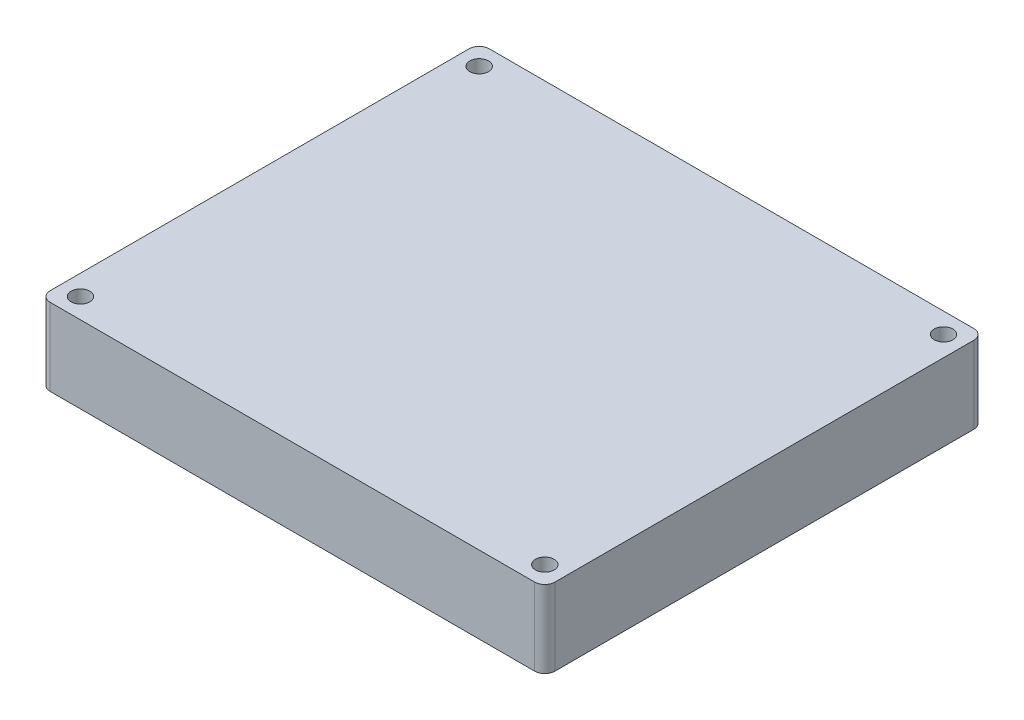
ISO-10303-21;
HEADER;
FILE_DESCRIPTION(('STEP AP214'),'2;1');
FILE_NAME('part.step','',(''),(''),'','','');
FILE_SCHEMA(('AUTOMOTIVE_DESIGN { 1 0 10303 214 1 1 1 1 }'));
ENDSEC;
DATA;
#1=APPLICATION_CONTEXT('core data for automotive mechanical design processes');
#2=APPLICATION_PROTOCOL_DEFINITION('international standard','automotive_design',2000,#1);
#3=PRODUCT_CONTEXT('',#1,'mechanical');
#4=PRODUCT('Part','Part','',(#3));
#5=PRODUCT_RELATED_PRODUCT_CATEGORY('part','',(#4));
#6=PRODUCT_DEFINITION_FORMATION('','',#4);
#7=PRODUCT_DEFINITION_CONTEXT('part definition',#1,'design');
#8=PRODUCT_DEFINITION('design','',#6,#7);
#9=PRODUCT_DEFINITION_SHAPE('','',#8);
#10=(LENGTH_UNIT() NAMED_UNIT(*) SI_UNIT(.MILLI.,.METRE.));
#11=(NAMED_UNIT(*) PLANE_ANGLE_UNIT() SI_UNIT($,.RADIAN.));
#12=(NAMED_UNIT(*) SI_UNIT($,.STERADIAN.) SOLID_ANGLE_UNIT());
#13=UNCERTAINTY_MEASURE_WITH_UNIT(LENGTH_MEASURE(1.E-05),#10,'distance_accuracy_value','');
#14=(GEOMETRIC_REPRESENTATION_CONTEXT(3) GLOBAL_UNCERTAINTY_ASSIGNED_CONTEXT((#13)) GLOBAL_UNIT_ASSIGNED_CONTEXT((#10,
#11,#12)) REPRESENTATION_CONTEXT('',''));
#15=CARTESIAN_POINT('',(0.,0.,0.));
#16=DIRECTION('',(0.,0.,1.));
#17=DIRECTION('',(1.,0.,0.));
#18=AXIS2_PLACEMENT_3D('',#15,#16,#17);
#19=CARTESIAN_POINT('',(-48.,15.29,41.5));
#20=DIRECTION('',(0.,-1.,0.));
#21=DIRECTION('',(0.,0.,-1.));
#22=AXIS2_PLACEMENT_3D('',#19,#20,#21);
#23=PLANE('',#22);
#24=CARTESIAN_POINT('',(-48.,15.29,41.5));
#25=DIRECTION('',(0.,1.,0.));
#26=DIRECTION('',(0.,0.,-1.));
#27=AXIS2_PLACEMENT_3D('',#24,#25,#26);
#28=CIRCLE('',#27,2.);
#29=CARTESIAN_POINT('',(-50.,15.29,41.5));
#30=VERTEX_POINT('',#29);
#31=CARTESIAN_POINT('',(-48.,15.29,43.5));
#32=VERTEX_POINT('',#31);
#33=EDGE_CURVE('E185',#30,#32,#28,.T.);
#34=ORIENTED_EDGE('',*,*,#33,.T.);
#35=DIRECTION('',(1.,0.,0.));
#36=VECTOR('',#35,1.);
#37=CARTESIAN_POINT('',(-48.,15.29,43.5));
#38=LINE('',#37,#36);
#39=CARTESIAN_POINT('',(48.,15.29,43.5));
#40=VERTEX_POINT('',#39);
#41=EDGE_CURVE('E116',#32,#40,#38,.T.);
#42=ORIENTED_EDGE('',*,*,#41,.T.);
#43=CARTESIAN_POINT('',(48.,15.29,41.5));
#44=DIRECTION('',(0.,1.,0.));
#45=DIRECTION('',(0.,0.,1.));
#46=AXIS2_PLACEMENT_3D('',#43,#44,#45);
#47=CIRCLE('',#46,2.);
#48=CARTESIAN_POINT('',(50.,15.29,41.5));
#49=VERTEX_POINT('',#48);
#50=EDGE_CURVE('E207',#40,#49,#47,.T.);
#51=ORIENTED_EDGE('',*,*,#50,.T.);
#52=DIRECTION('',(0.,0.,-1.));
#53=VECTOR('',#52,1.);
#54=CARTESIAN_POINT('',(50.,15.29,41.5));
#55=LINE('',#54,#53);
#56=CARTESIAN_POINT('',(50.,15.29,-41.5));
#57=VERTEX_POINT('',#56);
#58=EDGE_CURVE('E221',#49,#57,#55,.T.);
#59=ORIENTED_EDGE('',*,*,#58,.T.);
#60=CARTESIAN_POINT('',(48.,15.29,-41.5));
#61=DIRECTION('',(0.,1.,0.));
#62=DIRECTION('',(0.,0.,-1.));
#63=AXIS2_PLACEMENT_3D('',#60,#61,#62);
#64=CIRCLE('',#63,2.);
#65=CARTESIAN_POINT('',(48.,15.29,-43.5));
#66=VERTEX_POINT('',#65);
#67=EDGE_CURVE('E140',#57,#66,#64,.T.);
#68=ORIENTED_EDGE('',*,*,#67,.T.);
#69=DIRECTION('',(-1.,0.,0.));
#70=VECTOR('',#69,1.);
#71=CARTESIAN_POINT('',(-48.,15.29,-43.5));
#72=LINE('',#71,#70);
#73=CARTESIAN_POINT('',(-48.,15.29,-43.5));
#74=VERTEX_POINT('',#73);
#75=EDGE_CURVE('E134',#66,#74,#72,.T.);
#76=ORIENTED_EDGE('',*,*,#75,.T.);
#77=CARTESIAN_POINT('',(-48.,15.29,-41.5));
#78=DIRECTION('',(0.,1.,0.));
#79=DIRECTION('',(0.,0.,-1.));
#80=AXIS2_PLACEMENT_3D('',#77,#78,#79);
#81=CIRCLE('',#80,2.);
#82=CARTESIAN_POINT('',(-50.,15.29,-41.5));
#83=VERTEX_POINT('',#82);
#84=EDGE_CURVE('E138',#74,#83,#81,.T.);
#85=ORIENTED_EDGE('',*,*,#84,.T.);
#86=DIRECTION('',(0.,0.,1.));
#87=VECTOR('',#86,1.);
#88=CARTESIAN_POINT('',(-50.,15.29,41.5));
#89=LINE('',#88,#87);
#90=EDGE_CURVE('E67',#83,#30,#89,.T.);
#91=ORIENTED_EDGE('',*,*,#90,.T.);
#92=EDGE_LOOP('',(#34,#42,#51,#59,#68,#76,#85,#91));
#93=FACE_BOUND('',#92,.T.);
#94=CARTESIAN_POINT('',(46.,15.29,-39.5));
#95=DIRECTION('',(0.,1.,0.));
#96=DIRECTION('',(0.,0.,1.));
#97=AXIS2_PLACEMENT_3D('',#94,#95,#96);
#98=CIRCLE('',#97,1.85);
#99=CARTESIAN_POINT('',(46.,15.29,-37.65));
#100=VERTEX_POINT('',#99);
#101=EDGE_CURVE('E168',#100,#100,#98,.T.);
#102=ORIENTED_EDGE('',*,*,#101,.F.);
#103=EDGE_LOOP('',(#102));
#104=FACE_BOUND('',#103,.T.);
#105=CARTESIAN_POINT('',(46.,15.29,39.5));
#106=DIRECTION('',(0.,1.,0.));
#107=DIRECTION('',(0.,0.,1.));
#108=AXIS2_PLACEMENT_3D('',#105,#106,#107);
#109=CIRCLE('',#108,1.85);
#110=CARTESIAN_POINT('',(46.,15.29,41.35));
#111=VERTEX_POINT('',#110);
#112=EDGE_CURVE('E235',#111,#111,#109,.T.);
#113=ORIENTED_EDGE('',*,*,#112,.F.);
#114=EDGE_LOOP('',(#113));
#115=FACE_BOUND('',#114,.T.);
#116=CARTESIAN_POINT('',(-46.,15.29,39.5));
#117=DIRECTION('',(0.,1.,0.));
#118=DIRECTION('',(0.,0.,1.));
#119=AXIS2_PLACEMENT_3D('',#116,#117,#118);
#120=CIRCLE('',#119,1.85);
#121=CARTESIAN_POINT('',(-46.,15.29,41.35));
#122=VERTEX_POINT('',#121);
#123=EDGE_CURVE('E243',#122,#122,#120,.T.);
#124=ORIENTED_EDGE('',*,*,#123,.F.);
#125=EDGE_LOOP('',(#124));
#126=FACE_BOUND('',#125,.T.);
#127=CARTESIAN_POINT('',(-46.,15.29,-39.5));
#128=DIRECTION('',(0.,1.,0.));
#129=DIRECTION('',(0.,0.,1.));
#130=AXIS2_PLACEMENT_3D('',#127,#128,#129);
#131=CIRCLE('',#130,1.85);
#132=CARTESIAN_POINT('',(-46.,15.29,-37.65));
#133=VERTEX_POINT('',#132);
#134=EDGE_CURVE('E250',#133,#133,#131,.T.);
#135=ORIENTED_EDGE('',*,*,#134,.F.);
#136=EDGE_LOOP('',(#135));
#137=FACE_BOUND('',#136,.T.);
#138=ADVANCED_FACE('F46',(#93,#104,#115,#126,#137),#23,.F.);
#139=CARTESIAN_POINT('',(-48.,0.,41.5));
#140=DIRECTION('',(0.,-1.,0.));
#141=DIRECTION('',(0.,0.,-1.));
#142=AXIS2_PLACEMENT_3D('',#139,#140,#141);
#143=PLANE('',#142);
#144=CARTESIAN_POINT('',(-46.,0.,39.5));
#145=DIRECTION('',(0.,1.,0.));
#146=DIRECTION('',(0.,0.,1.));
#147=AXIS2_PLACEMENT_3D('',#144,#145,#146);
#148=CIRCLE('',#147,1.85);
#149=CARTESIAN_POINT('',(-46.,0.,41.35));
#150=VERTEX_POINT('',#149);
#151=EDGE_CURVE('E246',#150,#150,#148,.T.);
#152=ORIENTED_EDGE('',*,*,#151,.T.);
#153=EDGE_LOOP('',(#152));
#154=FACE_BOUND('',#153,.T.);
#155=CARTESIAN_POINT('',(46.,0.,-39.5));
#156=DIRECTION('',(0.,1.,0.));
#157=DIRECTION('',(0.,0.,1.));
#158=AXIS2_PLACEMENT_3D('',#155,#156,#157);
#159=CIRCLE('',#158,1.85);
#160=CARTESIAN_POINT('',(46.,0.,-37.65));
#161=VERTEX_POINT('',#160);
#162=EDGE_CURVE('E231',#161,#161,#159,.T.);
#163=ORIENTED_EDGE('',*,*,#162,.T.);
#164=EDGE_LOOP('',(#163));
#165=FACE_BOUND('',#164,.T.);
#166=CARTESIAN_POINT('',(-48.,0.,41.5));
#167=DIRECTION('',(0.,1.,0.));
#168=DIRECTION('',(0.,0.,-1.));
#169=AXIS2_PLACEMENT_3D('',#166,#167,#168);
#170=CIRCLE('',#169,2.);
#171=CARTESIAN_POINT('',(-50.,0.,41.5));
#172=VERTEX_POINT('',#171);
#173=CARTESIAN_POINT('',(-48.,0.,43.5));
#174=VERTEX_POINT('',#173);
#175=EDGE_CURVE('E163',#172,#174,#170,.T.);
#176=ORIENTED_EDGE('',*,*,#175,.F.);
#177=DIRECTION('',(0.,0.,1.));
#178=VECTOR('',#177,1.);
#179=CARTESIAN_POINT('',(-50.,0.,41.5));
#180=LINE('',#179,#178);
#181=CARTESIAN_POINT('',(-50.,0.,-41.5));
#182=VERTEX_POINT('',#181);
#183=EDGE_CURVE('E108',#182,#172,#180,.T.);
#184=ORIENTED_EDGE('',*,*,#183,.F.);
#185=CARTESIAN_POINT('',(-48.,0.,-41.5));
#186=DIRECTION('',(0.,1.,0.));
#187=DIRECTION('',(0.,0.,-1.));
#188=AXIS2_PLACEMENT_3D('',#185,#186,#187);
#189=CIRCLE('',#188,2.);
#190=CARTESIAN_POINT('',(-48.,0.,-43.5));
#191=VERTEX_POINT('',#190);
#192=EDGE_CURVE('E101',#191,#182,#189,.T.);
#193=ORIENTED_EDGE('',*,*,#192,.F.);
#194=DIRECTION('',(-1.,0.,0.));
#195=VECTOR('',#194,1.);
#196=CARTESIAN_POINT('',(-48.,0.,-43.5));
#197=LINE('',#196,#195);
#198=CARTESIAN_POINT('',(48.,0.,-43.5));
#199=VERTEX_POINT('',#198);
#200=EDGE_CURVE('E149',#199,#191,#197,.T.);
#201=ORIENTED_EDGE('',*,*,#200,.F.);
#202=CARTESIAN_POINT('',(48.,0.,-41.5));
#203=DIRECTION('',(0.,1.,0.));
#204=DIRECTION('',(0.,0.,-1.));
#205=AXIS2_PLACEMENT_3D('',#202,#203,#204);
#206=CIRCLE('',#205,2.);
#207=CARTESIAN_POINT('',(50.,0.,-41.5));
#208=VERTEX_POINT('',#207);
#209=EDGE_CURVE('E177',#208,#199,#206,.T.);
#210=ORIENTED_EDGE('',*,*,#209,.F.);
#211=DIRECTION('',(0.,0.,-1.));
#212=VECTOR('',#211,1.);
#213=CARTESIAN_POINT('',(50.,0.,41.5));
#214=LINE('',#213,#212);
#215=CARTESIAN_POINT('',(50.,0.,41.5));
#216=VERTEX_POINT('',#215);
#217=EDGE_CURVE('E174',#216,#208,#214,.T.);
#218=ORIENTED_EDGE('',*,*,#217,.F.);
#219=CARTESIAN_POINT('',(48.,0.,41.5));
#220=DIRECTION('',(0.,1.,0.));
#221=DIRECTION('',(0.,0.,1.));
#222=AXIS2_PLACEMENT_3D('',#219,#220,#221);
#223=CIRCLE('',#222,2.);
#224=CARTESIAN_POINT('',(48.,0.,43.5));
#225=VERTEX_POINT('',#224);
#226=EDGE_CURVE('E171',#225,#216,#223,.T.);
#227=ORIENTED_EDGE('',*,*,#226,.F.);
#228=DIRECTION('',(1.,0.,0.));
#229=VECTOR('',#228,1.);
#230=CARTESIAN_POINT('',(-48.,0.,43.5));
#231=LINE('',#230,#229);
#232=EDGE_CURVE('E167',#174,#225,#231,.T.);
#233=ORIENTED_EDGE('',*,*,#232,.F.);
#234=EDGE_LOOP('',(#176,#184,#193,#201,#210,#218,#227,#233));
#235=FACE_BOUND('',#234,.T.);
#236=CARTESIAN_POINT('',(46.,0.,39.5));
#237=DIRECTION('',(0.,1.,0.));
#238=DIRECTION('',(0.,0.,1.));
#239=AXIS2_PLACEMENT_3D('',#236,#237,#238);
#240=CIRCLE('',#239,1.85);
#241=CARTESIAN_POINT('',(46.,0.,41.35));
#242=VERTEX_POINT('',#241);
#243=EDGE_CURVE('E239',#242,#242,#240,.T.);
#244=ORIENTED_EDGE('',*,*,#243,.T.);
#245=EDGE_LOOP('',(#244));
#246=FACE_BOUND('',#245,.T.);
#247=CARTESIAN_POINT('',(-46.,0.,-39.5));
#248=DIRECTION('',(0.,1.,0.));
#249=DIRECTION('',(0.,0.,1.));
#250=AXIS2_PLACEMENT_3D('',#247,#248,#249);
#251=CIRCLE('',#250,1.85);
#252=CARTESIAN_POINT('',(-46.,0.,-37.65));
#253=VERTEX_POINT('',#252);
#254=EDGE_CURVE('E254',#253,#253,#251,.T.);
#255=ORIENTED_EDGE('',*,*,#254,.T.);
#256=EDGE_LOOP('',(#255));
#257=FACE_BOUND('',#256,.T.);
#258=ADVANCED_FACE('F211',(#154,#165,#235,#246,#257),#143,.T.);
#259=CARTESIAN_POINT('',(-48.,15.29,41.5));
#260=DIRECTION('',(0.,-1.,0.));
#261=DIRECTION('',(0.,0.,-1.));
#262=AXIS2_PLACEMENT_3D('',#259,#260,#261);
#263=CYLINDRICAL_SURFACE('',#262,2.);
#264=ORIENTED_EDGE('',*,*,#175,.T.);
#265=DIRECTION('',(0.,-1.,0.));
#266=VECTOR('',#265,1.);
#267=CARTESIAN_POINT('',(-48.,15.29,43.5));
#268=LINE('',#267,#266);
#269=EDGE_CURVE('E11',#32,#174,#268,.T.);
#270=ORIENTED_EDGE('',*,*,#269,.F.);
#271=ORIENTED_EDGE('',*,*,#33,.F.);
#272=DIRECTION('',(0.,-1.,0.));
#273=VECTOR('',#272,1.);
#274=CARTESIAN_POINT('',(-50.,15.29,41.5));
#275=LINE('',#274,#273);
#276=EDGE_CURVE('E159',#30,#172,#275,.T.);
#277=ORIENTED_EDGE('',*,*,#276,.T.);
#278=EDGE_LOOP('',(#264,#270,#271,#277));
#279=FACE_BOUND('',#278,.T.);
#280=ADVANCED_FACE('F48',(#279),#263,.T.);
#281=CARTESIAN_POINT('',(-48.,15.29,43.5));
#282=DIRECTION('',(0.,0.,-1.));
#283=DIRECTION('',(-1.,0.,0.));
#284=AXIS2_PLACEMENT_3D('',#281,#282,#283);
#285=PLANE('',#284);
#286=ORIENTED_EDGE('',*,*,#232,.T.);
#287=DIRECTION('',(0.,-1.,0.));
#288=VECTOR('',#287,1.);
#289=CARTESIAN_POINT('',(48.,15.29,43.5));
#290=LINE('',#289,#288);
#291=EDGE_CURVE('E56',#40,#225,#290,.T.);
#292=ORIENTED_EDGE('',*,*,#291,.F.);
#293=ORIENTED_EDGE('',*,*,#41,.F.);
#294=ORIENTED_EDGE('',*,*,#269,.T.);
#295=EDGE_LOOP('',(#286,#292,#293,#294));
#296=FACE_BOUND('',#295,.T.);
#297=ADVANCED_FACE('F287',(#296),#285,.F.);
#298=CARTESIAN_POINT('',(48.,15.29,41.5));
#299=DIRECTION('',(0.,-1.,0.));
#300=DIRECTION('',(0.,0.,-1.));
#301=AXIS2_PLACEMENT_3D('',#298,#299,#300);
#302=CYLINDRICAL_SURFACE('',#301,2.);
#303=ORIENTED_EDGE('',*,*,#226,.T.);
#304=DIRECTION('',(0.,-1.,0.));
#305=VECTOR('',#304,1.);
#306=CARTESIAN_POINT('',(50.,15.29,41.5));
#307=LINE('',#306,#305);
#308=EDGE_CURVE('E196',#49,#216,#307,.T.);
#309=ORIENTED_EDGE('',*,*,#308,.F.);
#310=ORIENTED_EDGE('',*,*,#50,.F.);
#311=ORIENTED_EDGE('',*,*,#291,.T.);
#312=EDGE_LOOP('',(#303,#309,#310,#311));
#313=FACE_BOUND('',#312,.T.);
#314=ADVANCED_FACE('F205',(#313),#302,.T.);
#315=CARTESIAN_POINT('',(50.,15.29,41.5));
#316=DIRECTION('',(-1.,0.,0.));
#317=DIRECTION('',(0.,0.,1.));
#318=AXIS2_PLACEMENT_3D('',#315,#316,#317);
#319=PLANE('',#318);
#320=ORIENTED_EDGE('',*,*,#217,.T.);
#321=DIRECTION('',(0.,-1.,0.));
#322=VECTOR('',#321,1.);
#323=CARTESIAN_POINT('',(50.,15.29,-41.5));
#324=LINE('',#323,#322);
#325=EDGE_CURVE('E192',#57,#208,#324,.T.);
#326=ORIENTED_EDGE('',*,*,#325,.F.);
#327=ORIENTED_EDGE('',*,*,#58,.F.);
#328=ORIENTED_EDGE('',*,*,#308,.T.);
#329=EDGE_LOOP('',(#320,#326,#327,#328));
#330=FACE_BOUND('',#329,.T.);
#331=ADVANCED_FACE('F216',(#330),#319,.F.);
#332=CARTESIAN_POINT('',(48.,15.29,-41.5));
#333=DIRECTION('',(0.,-1.,0.));
#334=DIRECTION('',(0.,0.,-1.));
#335=AXIS2_PLACEMENT_3D('',#332,#333,#334);
#336=CYLINDRICAL_SURFACE('',#335,2.);
#337=ORIENTED_EDGE('',*,*,#209,.T.);
#338=DIRECTION('',(0.,-1.,0.));
#339=VECTOR('',#338,1.);
#340=CARTESIAN_POINT('',(48.,15.29,-43.5));
#341=LINE('',#340,#339);
#342=EDGE_CURVE('E151',#66,#199,#341,.T.);
#343=ORIENTED_EDGE('',*,*,#342,.F.);
#344=ORIENTED_EDGE('',*,*,#67,.F.);
#345=ORIENTED_EDGE('',*,*,#325,.T.);
#346=EDGE_LOOP('',(#337,#343,#344,#345));
#347=FACE_BOUND('',#346,.T.);
#348=ADVANCED_FACE('F219',(#347),#336,.T.);
#349=CARTESIAN_POINT('',(-48.,15.29,-43.5));
#350=DIRECTION('',(0.,0.,1.));
#351=DIRECTION('',(1.,0.,0.));
#352=AXIS2_PLACEMENT_3D('',#349,#350,#351);
#353=PLANE('',#352);
#354=ORIENTED_EDGE('',*,*,#200,.T.);
#355=DIRECTION('',(0.,-1.,0.));
#356=VECTOR('',#355,1.);
#357=CARTESIAN_POINT('',(-48.,15.29,-43.5));
#358=LINE('',#357,#356);
#359=EDGE_CURVE('E146',#74,#191,#358,.T.);
#360=ORIENTED_EDGE('',*,*,#359,.F.);
#361=ORIENTED_EDGE('',*,*,#75,.F.);
#362=ORIENTED_EDGE('',*,*,#342,.T.);
#363=EDGE_LOOP('',(#354,#360,#361,#362));
#364=FACE_BOUND('',#363,.T.);
#365=ADVANCED_FACE('F147',(#364),#353,.F.);
#366=CARTESIAN_POINT('',(-48.,15.29,-41.5));
#367=DIRECTION('',(0.,-1.,0.));
#368=DIRECTION('',(0.,0.,-1.));
#369=AXIS2_PLACEMENT_3D('',#366,#367,#368);
#370=CYLINDRICAL_SURFACE('',#369,2.);
#371=ORIENTED_EDGE('',*,*,#192,.T.);
#372=DIRECTION('',(0.,-1.,0.));
#373=VECTOR('',#372,1.);
#374=CARTESIAN_POINT('',(-50.,15.29,-41.5));
#375=LINE('',#374,#373);
#376=EDGE_CURVE('E152',#83,#182,#375,.T.);
#377=ORIENTED_EDGE('',*,*,#376,.F.);
#378=ORIENTED_EDGE('',*,*,#84,.F.);
#379=ORIENTED_EDGE('',*,*,#359,.T.);
#380=EDGE_LOOP('',(#371,#377,#378,#379));
#381=FACE_BOUND('',#380,.T.);
#382=ADVANCED_FACE('F154',(#381),#370,.T.);
#383=CARTESIAN_POINT('',(-50.,15.29,41.5));
#384=DIRECTION('',(1.,0.,0.));
#385=DIRECTION('',(0.,0.,-1.));
#386=AXIS2_PLACEMENT_3D('',#383,#384,#385);
#387=PLANE('',#386);
#388=ORIENTED_EDGE('',*,*,#183,.T.);
#389=ORIENTED_EDGE('',*,*,#276,.F.);
#390=ORIENTED_EDGE('',*,*,#90,.F.);
#391=ORIENTED_EDGE('',*,*,#376,.T.);
#392=EDGE_LOOP('',(#388,#389,#390,#391));
#393=FACE_BOUND('',#392,.T.);
#394=ADVANCED_FACE('F275',(#393),#387,.F.);
#395=CARTESIAN_POINT('',(46.,15.29,-39.5));
#396=DIRECTION('',(0.,-1.,0.));
#397=DIRECTION('',(0.,0.,-1.));
#398=AXIS2_PLACEMENT_3D('',#395,#396,#397);
#399=CYLINDRICAL_SURFACE('',#398,1.85);
#400=ORIENTED_EDGE('',*,*,#101,.T.);
#401=EDGE_LOOP('',(#400));
#402=FACE_BOUND('',#401,.T.);
#403=ORIENTED_EDGE('',*,*,#162,.F.);
#404=EDGE_LOOP('',(#403));
#405=FACE_BOUND('',#404,.T.);
#406=ADVANCED_FACE('F272',(#402,#405),#399,.F.);
#407=CARTESIAN_POINT('',(46.,15.29,39.5));
#408=DIRECTION('',(0.,-1.,0.));
#409=DIRECTION('',(0.,0.,-1.));
#410=AXIS2_PLACEMENT_3D('',#407,#408,#409);
#411=CYLINDRICAL_SURFACE('',#410,1.85);
#412=ORIENTED_EDGE('',*,*,#112,.T.);
#413=EDGE_LOOP('',(#412));
#414=FACE_BOUND('',#413,.T.);
#415=ORIENTED_EDGE('',*,*,#243,.F.);
#416=EDGE_LOOP('',(#415));
#417=FACE_BOUND('',#416,.T.);
#418=ADVANCED_FACE('F337',(#414,#417),#411,.F.);
#419=CARTESIAN_POINT('',(-46.,15.29,39.5));
#420=DIRECTION('',(0.,-1.,0.));
#421=DIRECTION('',(0.,0.,-1.));
#422=AXIS2_PLACEMENT_3D('',#419,#420,#421);
#423=CYLINDRICAL_SURFACE('',#422,1.85);
#424=ORIENTED_EDGE('',*,*,#123,.T.);
#425=EDGE_LOOP('',(#424));
#426=FACE_BOUND('',#425,.T.);
#427=ORIENTED_EDGE('',*,*,#151,.F.);
#428=EDGE_LOOP('',(#427));
#429=FACE_BOUND('',#428,.T.);
#430=ADVANCED_FACE('F328',(#426,#429),#423,.F.);
#431=CARTESIAN_POINT('',(-46.,15.29,-39.5));
#432=DIRECTION('',(0.,-1.,0.));
#433=DIRECTION('',(0.,0.,-1.));
#434=AXIS2_PLACEMENT_3D('',#431,#432,#433);
#435=CYLINDRICAL_SURFACE('',#434,1.85);
#436=ORIENTED_EDGE('',*,*,#134,.T.);
#437=EDGE_LOOP('',(#436));
#438=FACE_BOUND('',#437,.T.);
#439=ORIENTED_EDGE('',*,*,#254,.F.);
#440=EDGE_LOOP('',(#439));
#441=FACE_BOUND('',#440,.T.);
#442=ADVANCED_FACE('F261',(#438,#441),#435,.F.);
#443=CLOSED_SHELL('',(#138,#258,#280,#297,#314,#331,#348,#365,#382,#394,#406,#418,#430,#442));
#444=MANIFOLD_SOLID_BREP('B2',#443);
#445=ADVANCED_BREP_SHAPE_REPRESENTATION('',(#18,#444),#14);
#446=SHAPE_DEFINITION_REPRESENTATION(#9,#445);
ENDSEC;
END-ISO-10303-21;
